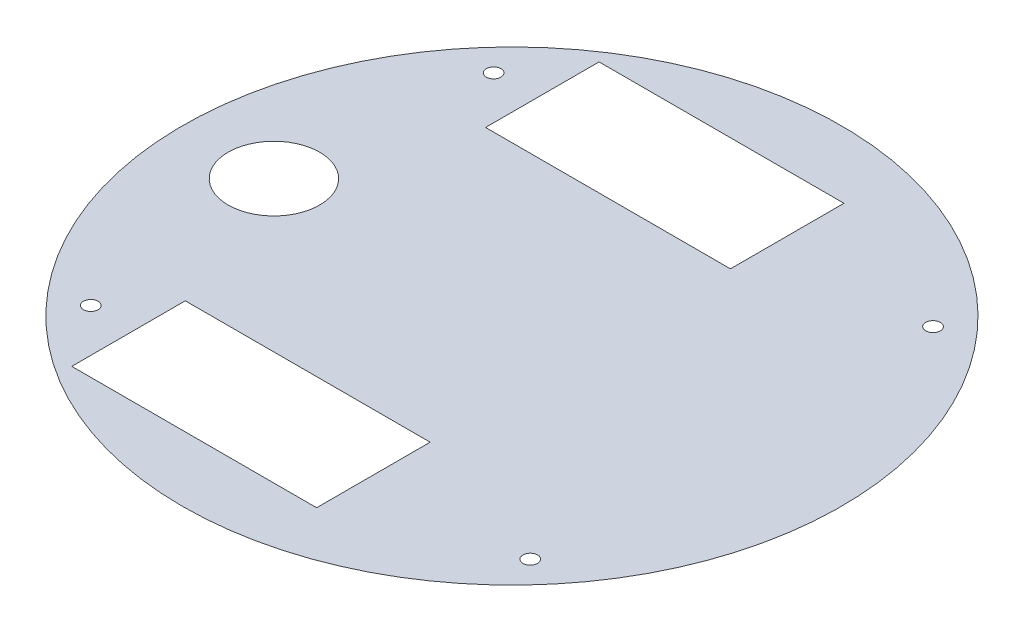
ISO-10303-21;
HEADER;
FILE_DESCRIPTION(('STEP AP214'),'2;1');
FILE_NAME('part.step','',(''),(''),'','','');
FILE_SCHEMA(('AUTOMOTIVE_DESIGN { 1 0 10303 214 1 1 1 1 }'));
ENDSEC;
DATA;
#1=APPLICATION_CONTEXT('core data for automotive mechanical design processes');
#2=APPLICATION_PROTOCOL_DEFINITION('international standard','automotive_design',2000,#1);
#3=PRODUCT_CONTEXT('',#1,'mechanical');
#4=PRODUCT('Part','Part','',(#3));
#5=PRODUCT_RELATED_PRODUCT_CATEGORY('part','',(#4));
#6=PRODUCT_DEFINITION_FORMATION('','',#4);
#7=PRODUCT_DEFINITION_CONTEXT('part definition',#1,'design');
#8=PRODUCT_DEFINITION('design','',#6,#7);
#9=PRODUCT_DEFINITION_SHAPE('','',#8);
#10=(LENGTH_UNIT() NAMED_UNIT(*) SI_UNIT(.MILLI.,.METRE.));
#11=(NAMED_UNIT(*) PLANE_ANGLE_UNIT() SI_UNIT($,.RADIAN.));
#12=(NAMED_UNIT(*) SI_UNIT($,.STERADIAN.) SOLID_ANGLE_UNIT());
#13=UNCERTAINTY_MEASURE_WITH_UNIT(LENGTH_MEASURE(1.E-05),#10,'distance_accuracy_value','');
#14=(GEOMETRIC_REPRESENTATION_CONTEXT(3) GLOBAL_UNCERTAINTY_ASSIGNED_CONTEXT((#13)) GLOBAL_UNIT_ASSIGNED_CONTEXT((#10,
#11,#12)) REPRESENTATION_CONTEXT('',''));
#15=CARTESIAN_POINT('',(0.,0.,0.));
#16=DIRECTION('',(0.,0.,1.));
#17=DIRECTION('',(1.,0.,0.));
#18=AXIS2_PLACEMENT_3D('',#15,#16,#17);
#19=CARTESIAN_POINT('',(6.0478827098623,-22.8430459681049,179.9999999651));
#20=DIRECTION('',(1.,0.,0.));
#21=DIRECTION('',(0.,1.,0.));
#22=AXIS2_PLACEMENT_3D('',#19,#20,#21);
#23=CYLINDRICAL_SURFACE('',#22,10.5);
#24=CARTESIAN_POINT('',(6.0478827098623,-22.8430459681049,179.9999999651));
#25=DIRECTION('',(1.,0.,0.));
#26=DIRECTION('',(0.,0.,-1.));
#27=AXIS2_PLACEMENT_3D('',#24,#25,#26);
#28=CIRCLE('',#27,10.5);
#29=CARTESIAN_POINT('',(6.0478827098623,-22.8430459681049,169.4999999651));
#30=VERTEX_POINT('',#29);
#31=EDGE_CURVE('E177',#30,#30,#28,.T.);
#32=ORIENTED_EDGE('',*,*,#31,.F.);
#33=EDGE_LOOP('',(#32));
#34=FACE_BOUND('',#33,.T.);
#35=CARTESIAN_POINT('',(26.0478827098623,-22.8430459681049,179.9999999651));
#36=DIRECTION('',(1.,0.,0.));
#37=DIRECTION('',(0.,0.,-1.));
#38=AXIS2_PLACEMENT_3D('',#35,#36,#37);
#39=CIRCLE('',#38,10.5);
#40=CARTESIAN_POINT('',(26.0478827098623,-22.8430459681049,169.4999999651));
#41=VERTEX_POINT('',#40);
#42=EDGE_CURVE('E180',#41,#41,#39,.T.);
#43=ORIENTED_EDGE('',*,*,#42,.T.);
#44=EDGE_LOOP('',(#43));
#45=FACE_BOUND('',#44,.T.);
#46=ADVANCED_FACE('F76',(#34,#45),#23,.F.);
#47=CARTESIAN_POINT('',(6.0478827098623,0.,192.9999999651));
#48=DIRECTION('',(0.,0.,1.));
#49=DIRECTION('',(1.,0.,0.));
#50=AXIS2_PLACEMENT_3D('',#47,#48,#49);
#51=PLANE('',#50);
#52=DIRECTION('',(1.,0.,0.));
#53=VECTOR('',#52,1.);
#54=CARTESIAN_POINT('',(6.0478827098623,-2.84304596810474,192.9999999651));
#55=LINE('',#54,#53);
#56=CARTESIAN_POINT('',(6.0478827098623,-2.84304596810474,192.9999999651));
#57=VERTEX_POINT('',#56);
#58=CARTESIAN_POINT('',(26.0478827098623,-2.84304596810474,192.9999999651));
#59=VERTEX_POINT('',#58);
#60=EDGE_CURVE('E13',#57,#59,#55,.T.);
#61=ORIENTED_EDGE('',*,*,#60,.F.);
#62=DIRECTION('',(0.,-1.,0.));
#63=VECTOR('',#62,1.);
#64=CARTESIAN_POINT('',(6.0478827098623,0.,192.9999999651));
#65=LINE('',#64,#63);
#66=CARTESIAN_POINT('',(6.0478827098623,-22.843045968105,192.9999999651));
#67=VERTEX_POINT('',#66);
#68=EDGE_CURVE('E192',#57,#67,#65,.T.);
#69=ORIENTED_EDGE('',*,*,#68,.T.);
#70=DIRECTION('',(1.,0.,0.));
#71=VECTOR('',#70,1.);
#72=CARTESIAN_POINT('',(6.0478827098623,-22.843045968105,192.9999999651));
#73=LINE('',#72,#71);
#74=CARTESIAN_POINT('',(26.0478827098623,-22.843045968105,192.9999999651));
#75=VERTEX_POINT('',#74);
#76=EDGE_CURVE('E167',#67,#75,#73,.T.);
#77=ORIENTED_EDGE('',*,*,#76,.T.);
#78=DIRECTION('',(0.,-1.,0.));
#79=VECTOR('',#78,1.);
#80=CARTESIAN_POINT('',(26.0478827098623,0.,192.9999999651));
#81=LINE('',#80,#79);
#82=EDGE_CURVE('E143',#59,#75,#81,.T.);
#83=ORIENTED_EDGE('',*,*,#82,.F.);
#84=EDGE_LOOP('',(#61,#69,#77,#83));
#85=FACE_BOUND('',#84,.T.);
#86=ADVANCED_FACE('F217',(#85),#51,.T.);
#87=CARTESIAN_POINT('',(6.0478827098623,2.15695403189528,0.));
#88=DIRECTION('',(0.,1.,0.));
#89=DIRECTION('',(0.,0.,1.));
#90=AXIS2_PLACEMENT_3D('',#87,#88,#89);
#91=PLANE('',#90);
#92=DIRECTION('',(0.,0.,1.));
#93=VECTOR('',#92,1.);
#94=CARTESIAN_POINT('',(26.0478827098623,2.15695403189528,0.));
#95=LINE('',#94,#93);
#96=CARTESIAN_POINT('',(26.0478827098623,2.15695403189526,157.9999999651));
#97=VERTEX_POINT('',#96);
#98=CARTESIAN_POINT('',(26.0478827098623,2.15695403189526,201.9999999651));
#99=VERTEX_POINT('',#98);
#100=EDGE_CURVE('E130',#97,#99,#95,.T.);
#101=ORIENTED_EDGE('',*,*,#100,.F.);
#102=DIRECTION('',(1.,0.,0.));
#103=VECTOR('',#102,1.);
#104=CARTESIAN_POINT('',(6.0478827098623,2.15695403189526,157.9999999651));
#105=LINE('',#104,#103);
#106=CARTESIAN_POINT('',(6.0478827098623,2.15695403189526,157.9999999651));
#107=VERTEX_POINT('',#106);
#108=EDGE_CURVE('E162',#107,#97,#105,.T.);
#109=ORIENTED_EDGE('',*,*,#108,.F.);
#110=DIRECTION('',(0.,0.,1.));
#111=VECTOR('',#110,1.);
#112=CARTESIAN_POINT('',(6.0478827098623,2.15695403189528,0.));
#113=LINE('',#112,#111);
#114=CARTESIAN_POINT('',(6.0478827098623,2.15695403189526,201.9999999651));
#115=VERTEX_POINT('',#114);
#116=EDGE_CURVE('E149',#107,#115,#113,.T.);
#117=ORIENTED_EDGE('',*,*,#116,.T.);
#118=DIRECTION('',(1.,0.,0.));
#119=VECTOR('',#118,1.);
#120=CARTESIAN_POINT('',(6.0478827098623,2.15695403189526,201.9999999651));
#121=LINE('',#120,#119);
#122=EDGE_CURVE('E147',#115,#99,#121,.T.);
#123=ORIENTED_EDGE('',*,*,#122,.T.);
#124=EDGE_LOOP('',(#101,#109,#117,#123));
#125=FACE_BOUND('',#124,.T.);
#126=ADVANCED_FACE('F148',(#125),#91,.T.);
#127=CARTESIAN_POINT('',(6.0478827098623,0.,166.9999999651));
#128=DIRECTION('',(0.,0.,1.));
#129=DIRECTION('',(1.,0.,0.));
#130=AXIS2_PLACEMENT_3D('',#127,#128,#129);
#131=PLANE('',#130);
#132=DIRECTION('',(0.,-1.,0.));
#133=VECTOR('',#132,1.);
#134=CARTESIAN_POINT('',(6.0478827098623,0.,166.9999999651));
#135=LINE('',#134,#133);
#136=CARTESIAN_POINT('',(6.0478827098623,-2.84304596810474,166.9999999651));
#137=VERTEX_POINT('',#136);
#138=CARTESIAN_POINT('',(6.0478827098623,-22.843045968105,166.9999999651));
#139=VERTEX_POINT('',#138);
#140=EDGE_CURVE('E196',#137,#139,#135,.T.);
#141=ORIENTED_EDGE('',*,*,#140,.F.);
#142=DIRECTION('',(1.,0.,0.));
#143=VECTOR('',#142,1.);
#144=CARTESIAN_POINT('',(6.0478827098623,-2.84304596810474,166.9999999651));
#145=LINE('',#144,#143);
#146=CARTESIAN_POINT('',(26.0478827098623,-2.84304596810474,166.9999999651));
#147=VERTEX_POINT('',#146);
#148=EDGE_CURVE('E86',#137,#147,#145,.T.);
#149=ORIENTED_EDGE('',*,*,#148,.T.);
#150=DIRECTION('',(0.,-1.,0.));
#151=VECTOR('',#150,1.);
#152=CARTESIAN_POINT('',(26.0478827098623,0.,166.9999999651));
#153=LINE('',#152,#151);
#154=CARTESIAN_POINT('',(26.0478827098623,-22.843045968105,166.9999999651));
#155=VERTEX_POINT('',#154);
#156=EDGE_CURVE('E144',#147,#155,#153,.T.);
#157=ORIENTED_EDGE('',*,*,#156,.T.);
#158=DIRECTION('',(1.,0.,0.));
#159=VECTOR('',#158,1.);
#160=CARTESIAN_POINT('',(6.0478827098623,-22.843045968105,166.9999999651));
#161=LINE('',#160,#159);
#162=EDGE_CURVE('E174',#139,#155,#161,.T.);
#163=ORIENTED_EDGE('',*,*,#162,.F.);
#164=EDGE_LOOP('',(#141,#149,#157,#163));
#165=FACE_BOUND('',#164,.T.);
#166=ADVANCED_FACE('F230',(#165),#131,.F.);
#167=CARTESIAN_POINT('',(6.0478827098623,-22.8430459681049,179.9999999651));
#168=DIRECTION('',(1.,0.,0.));
#169=DIRECTION('',(0.,1.,0.));
#170=AXIS2_PLACEMENT_3D('',#167,#168,#169);
#171=CYLINDRICAL_SURFACE('',#170,13.);
#172=CARTESIAN_POINT('',(26.0478827098623,-22.8430459681049,179.9999999651));
#173=DIRECTION('',(1.,0.,0.));
#174=DIRECTION('',(0.,0.,-1.));
#175=AXIS2_PLACEMENT_3D('',#172,#173,#174);
#176=CIRCLE('',#175,13.);
#177=EDGE_CURVE('E165',#155,#75,#176,.F.);
#178=ORIENTED_EDGE('',*,*,#177,.T.);
#179=ORIENTED_EDGE('',*,*,#76,.F.);
#180=CARTESIAN_POINT('',(6.0478827098623,-22.8430459681049,179.9999999651));
#181=DIRECTION('',(1.,0.,0.));
#182=DIRECTION('',(0.,0.,-1.));
#183=AXIS2_PLACEMENT_3D('',#180,#181,#182);
#184=CIRCLE('',#183,13.);
#185=EDGE_CURVE('E183',#139,#67,#184,.F.);
#186=ORIENTED_EDGE('',*,*,#185,.F.);
#187=ORIENTED_EDGE('',*,*,#162,.T.);
#188=EDGE_LOOP('',(#178,#179,#186,#187));
#189=FACE_BOUND('',#188,.T.);
#190=ADVANCED_FACE('F213',(#189),#171,.T.);
#191=CARTESIAN_POINT('',(26.0478827098623,0.,0.));
#192=DIRECTION('',(1.,0.,0.));
#193=DIRECTION('',(0.,0.,-1.));
#194=AXIS2_PLACEMENT_3D('',#191,#192,#193);
#195=PLANE('',#194);
#196=ORIENTED_EDGE('',*,*,#177,.F.);
#197=ORIENTED_EDGE('',*,*,#156,.F.);
#198=DIRECTION('',(0.,0.,-1.));
#199=VECTOR('',#198,1.);
#200=CARTESIAN_POINT('',(26.0478827098623,-2.84304596810474,166.9999999651));
#201=LINE('',#200,#199);
#202=CARTESIAN_POINT('',(26.0478827098623,-2.84304596810474,157.9999999651));
#203=VERTEX_POINT('',#202);
#204=EDGE_CURVE('E170',#147,#203,#201,.T.);
#205=ORIENTED_EDGE('',*,*,#204,.T.);
#206=DIRECTION('',(0.,-1.,0.));
#207=VECTOR('',#206,1.);
#208=CARTESIAN_POINT('',(26.0478827098623,2.15695403189526,157.9999999651));
#209=LINE('',#208,#207);
#210=EDGE_CURVE('E139',#97,#203,#209,.T.);
#211=ORIENTED_EDGE('',*,*,#210,.F.);
#212=ORIENTED_EDGE('',*,*,#100,.T.);
#213=DIRECTION('',(0.,-1.,0.));
#214=VECTOR('',#213,1.);
#215=CARTESIAN_POINT('',(26.0478827098623,2.15695403189526,201.9999999651));
#216=LINE('',#215,#214);
#217=CARTESIAN_POINT('',(26.0478827098623,-2.84304596810474,201.9999999651));
#218=VERTEX_POINT('',#217);
#219=EDGE_CURVE('E136',#99,#218,#216,.T.);
#220=ORIENTED_EDGE('',*,*,#219,.T.);
#221=DIRECTION('',(0.,0.,1.));
#222=VECTOR('',#221,1.);
#223=CARTESIAN_POINT('',(26.0478827098623,-2.84304596810474,192.9999999651));
#224=LINE('',#223,#222);
#225=EDGE_CURVE('E154',#59,#218,#224,.T.);
#226=ORIENTED_EDGE('',*,*,#225,.F.);
#227=ORIENTED_EDGE('',*,*,#82,.T.);
#228=EDGE_LOOP('',(#196,#197,#205,#211,#212,#220,#226,#227));
#229=FACE_BOUND('',#228,.T.);
#230=ORIENTED_EDGE('',*,*,#42,.F.);
#231=EDGE_LOOP('',(#230));
#232=FACE_BOUND('',#231,.T.);
#233=ADVANCED_FACE('F133',(#229,#232),#195,.T.);
#234=CARTESIAN_POINT('',(6.0478827098623,0.,0.));
#235=DIRECTION('',(1.,0.,0.));
#236=DIRECTION('',(0.,0.,-1.));
#237=AXIS2_PLACEMENT_3D('',#234,#235,#236);
#238=PLANE('',#237);
#239=ORIENTED_EDGE('',*,*,#185,.T.);
#240=ORIENTED_EDGE('',*,*,#68,.F.);
#241=DIRECTION('',(0.,0.,1.));
#242=VECTOR('',#241,1.);
#243=CARTESIAN_POINT('',(6.0478827098623,-2.84304596810474,192.9999999651));
#244=LINE('',#243,#242);
#245=CARTESIAN_POINT('',(6.0478827098623,-2.84304596810474,201.9999999651));
#246=VERTEX_POINT('',#245);
#247=EDGE_CURVE('E153',#57,#246,#244,.T.);
#248=ORIENTED_EDGE('',*,*,#247,.T.);
#249=DIRECTION('',(0.,-1.,0.));
#250=VECTOR('',#249,1.);
#251=CARTESIAN_POINT('',(6.0478827098623,2.15695403189526,201.9999999651));
#252=LINE('',#251,#250);
#253=EDGE_CURVE('E151',#115,#246,#252,.T.);
#254=ORIENTED_EDGE('',*,*,#253,.F.);
#255=ORIENTED_EDGE('',*,*,#116,.F.);
#256=DIRECTION('',(0.,-1.,0.));
#257=VECTOR('',#256,1.);
#258=CARTESIAN_POINT('',(6.0478827098623,2.15695403189526,157.9999999651));
#259=LINE('',#258,#257);
#260=CARTESIAN_POINT('',(6.0478827098623,-2.84304596810474,157.9999999651));
#261=VERTEX_POINT('',#260);
#262=EDGE_CURVE('E163',#107,#261,#259,.T.);
#263=ORIENTED_EDGE('',*,*,#262,.T.);
#264=DIRECTION('',(0.,0.,-1.));
#265=VECTOR('',#264,1.);
#266=CARTESIAN_POINT('',(6.0478827098623,-2.84304596810474,166.9999999651));
#267=LINE('',#266,#265);
#268=EDGE_CURVE('E169',#137,#261,#267,.T.);
#269=ORIENTED_EDGE('',*,*,#268,.F.);
#270=ORIENTED_EDGE('',*,*,#140,.T.);
#271=EDGE_LOOP('',(#239,#240,#248,#254,#255,#263,#269,#270));
#272=FACE_BOUND('',#271,.T.);
#273=ORIENTED_EDGE('',*,*,#31,.T.);
#274=EDGE_LOOP('',(#273));
#275=FACE_BOUND('',#274,.T.);
#276=ADVANCED_FACE('F205',(#272,#275),#238,.F.);
#277=CARTESIAN_POINT('',(6.0478827098623,2.15695403189526,201.9999999651));
#278=DIRECTION('',(0.,0.,1.));
#279=DIRECTION('',(1.,0.,0.));
#280=AXIS2_PLACEMENT_3D('',#277,#278,#279);
#281=PLANE('',#280);
#282=ORIENTED_EDGE('',*,*,#219,.F.);
#283=ORIENTED_EDGE('',*,*,#122,.F.);
#284=ORIENTED_EDGE('',*,*,#253,.T.);
#285=DIRECTION('',(1.,0.,0.));
#286=VECTOR('',#285,1.);
#287=CARTESIAN_POINT('',(6.0478827098623,-2.84304596810474,201.9999999651));
#288=LINE('',#287,#286);
#289=EDGE_CURVE('E80',#246,#218,#288,.T.);
#290=ORIENTED_EDGE('',*,*,#289,.T.);
#291=EDGE_LOOP('',(#282,#283,#284,#290));
#292=FACE_BOUND('',#291,.T.);
#293=ADVANCED_FACE('F152',(#292),#281,.T.);
#294=CARTESIAN_POINT('',(6.0478827098623,-2.84304596810474,192.9999999651));
#295=DIRECTION('',(0.,1.,0.));
#296=DIRECTION('',(0.,0.,1.));
#297=AXIS2_PLACEMENT_3D('',#294,#295,#296);
#298=PLANE('',#297);
#299=ORIENTED_EDGE('',*,*,#225,.T.);
#300=ORIENTED_EDGE('',*,*,#289,.F.);
#301=ORIENTED_EDGE('',*,*,#247,.F.);
#302=ORIENTED_EDGE('',*,*,#60,.T.);
#303=EDGE_LOOP('',(#299,#300,#301,#302));
#304=FACE_BOUND('',#303,.T.);
#305=ADVANCED_FACE('F78',(#304),#298,.F.);
#306=CARTESIAN_POINT('',(6.0478827098623,2.15695403189526,157.9999999651));
#307=DIRECTION('',(0.,0.,1.));
#308=DIRECTION('',(1.,0.,0.));
#309=AXIS2_PLACEMENT_3D('',#306,#307,#308);
#310=PLANE('',#309);
#311=ORIENTED_EDGE('',*,*,#210,.T.);
#312=DIRECTION('',(1.,0.,0.));
#313=VECTOR('',#312,1.);
#314=CARTESIAN_POINT('',(6.0478827098623,-2.84304596810474,157.9999999651));
#315=LINE('',#314,#313);
#316=EDGE_CURVE('E160',#261,#203,#315,.T.);
#317=ORIENTED_EDGE('',*,*,#316,.F.);
#318=ORIENTED_EDGE('',*,*,#262,.F.);
#319=ORIENTED_EDGE('',*,*,#108,.T.);
#320=EDGE_LOOP('',(#311,#317,#318,#319));
#321=FACE_BOUND('',#320,.T.);
#322=ADVANCED_FACE('F227',(#321),#310,.F.);
#323=CARTESIAN_POINT('',(6.0478827098623,-2.84304596810474,166.9999999651));
#324=DIRECTION('',(0.,-1.,0.));
#325=DIRECTION('',(1.,0.,0.));
#326=AXIS2_PLACEMENT_3D('',#323,#324,#325);
#327=PLANE('',#326);
#328=ORIENTED_EDGE('',*,*,#204,.F.);
#329=ORIENTED_EDGE('',*,*,#148,.F.);
#330=ORIENTED_EDGE('',*,*,#268,.T.);
#331=ORIENTED_EDGE('',*,*,#316,.T.);
#332=EDGE_LOOP('',(#328,#329,#330,#331));
#333=FACE_BOUND('',#332,.T.);
#334=ADVANCED_FACE('F228',(#333),#327,.T.);
#335=CLOSED_SHELL('',(#46,#86,#126,#166,#190,#233,#276,#293,#305,#322,#334));
#336=MANIFOLD_SOLID_BREP('B2',#335);
#337=CARTESIAN_POINT('',(-4.2343678264036,2.15695403189526,180.));
#338=DIRECTION('',(0.,1.,0.));
#339=DIRECTION('',(0.,0.,1.));
#340=AXIS2_PLACEMENT_3D('',#337,#338,#339);
#341=PLANE('',#340);
#342=CARTESIAN_POINT('',(55.7656321735964,2.15695403189526,125.));
#343=DIRECTION('',(0.,1.,0.));
#344=DIRECTION('',(0.,0.,1.));
#345=AXIS2_PLACEMENT_3D('',#342,#343,#344);
#346=CIRCLE('',#345,2.);
#347=CARTESIAN_POINT('',(55.7656321735964,2.15695403189526,127.));
#348=VERTEX_POINT('',#347);
#349=EDGE_CURVE('E358',#348,#348,#346,.T.);
#350=ORIENTED_EDGE('',*,*,#349,.T.);
#351=EDGE_LOOP('',(#350));
#352=FACE_BOUND('',#351,.T.);
#353=CARTESIAN_POINT('',(55.7656321735964,2.15695403189526,235.));
#354=DIRECTION('',(0.,1.,0.));
#355=DIRECTION('',(0.,0.,1.));
#356=AXIS2_PLACEMENT_3D('',#353,#354,#355);
#357=CIRCLE('',#356,2.);
#358=CARTESIAN_POINT('',(55.7656321735964,2.15695403189526,237.));
#359=VERTEX_POINT('',#358);
#360=EDGE_CURVE('E363',#359,#359,#357,.T.);
#361=ORIENTED_EDGE('',*,*,#360,.T.);
#362=EDGE_LOOP('',(#361));
#363=FACE_BOUND('',#362,.T.);
#364=CARTESIAN_POINT('',(-64.2343678264036,2.15695403189526,235.));
#365=DIRECTION('',(0.,1.,0.));
#366=DIRECTION('',(0.,0.,1.));
#367=AXIS2_PLACEMENT_3D('',#364,#365,#366);
#368=CIRCLE('',#367,2.);
#369=CARTESIAN_POINT('',(-64.2343678264036,2.15695403189526,237.));
#370=VERTEX_POINT('',#369);
#371=EDGE_CURVE('E444',#370,#370,#368,.T.);
#372=ORIENTED_EDGE('',*,*,#371,.T.);
#373=EDGE_LOOP('',(#372));
#374=FACE_BOUND('',#373,.T.);
#375=CARTESIAN_POINT('',(-64.2343678264036,2.15695403189526,125.));
#376=DIRECTION('',(0.,1.,0.));
#377=DIRECTION('',(0.,0.,1.));
#378=AXIS2_PLACEMENT_3D('',#375,#376,#377);
#379=CIRCLE('',#378,2.);
#380=CARTESIAN_POINT('',(-64.2343678264036,2.15695403189526,127.));
#381=VERTEX_POINT('',#380);
#382=EDGE_CURVE('E447',#381,#381,#379,.T.);
#383=ORIENTED_EDGE('',*,*,#382,.T.);
#384=EDGE_LOOP('',(#383));
#385=FACE_BOUND('',#384,.T.);
#386=CARTESIAN_POINT('',(-69.2343678264036,2.15695403189526,180.));
#387=DIRECTION('',(0.,1.,0.));
#388=DIRECTION('',(0.,0.,1.));
#389=AXIS2_PLACEMENT_3D('',#386,#387,#388);
#390=CIRCLE('',#389,12.5);
#391=CARTESIAN_POINT('',(-69.2343678264036,2.15695403189526,192.5));
#392=VERTEX_POINT('',#391);
#393=EDGE_CURVE('E408',#392,#392,#390,.T.);
#394=ORIENTED_EDGE('',*,*,#393,.T.);
#395=EDGE_LOOP('',(#394));
#396=FACE_BOUND('',#395,.T.);
#397=DIRECTION('',(1.,0.,0.));
#398=VECTOR('',#397,1.);
#399=CARTESIAN_POINT('',(-52.4343555870664,2.15695403189526,139.));
#400=LINE('',#399,#398);
#401=CARTESIAN_POINT('',(-52.4343555870664,2.15695403189526,139.));
#402=VERTEX_POINT('',#401);
#403=CARTESIAN_POINT('',(14.4343555870664,2.15695403189526,139.));
#404=VERTEX_POINT('',#403);
#405=EDGE_CURVE('E400',#402,#404,#400,.T.);
#406=ORIENTED_EDGE('',*,*,#405,.T.);
#407=DIRECTION('',(0.,0.,-1.));
#408=VECTOR('',#407,1.);
#409=CARTESIAN_POINT('',(14.4343555870664,2.15695403189526,108.));
#410=LINE('',#409,#408);
#411=CARTESIAN_POINT('',(14.4343555870664,2.15695403189526,108.));
#412=VERTEX_POINT('',#411);
#413=EDGE_CURVE('E403',#404,#412,#410,.T.);
#414=ORIENTED_EDGE('',*,*,#413,.T.);
#415=DIRECTION('',(-1.,0.,0.));
#416=VECTOR('',#415,1.);
#417=CARTESIAN_POINT('',(-52.4343555870664,2.15695403189526,108.));
#418=LINE('',#417,#416);
#419=CARTESIAN_POINT('',(-52.4343555870664,2.15695403189526,108.));
#420=VERTEX_POINT('',#419);
#421=EDGE_CURVE('E411',#412,#420,#418,.T.);
#422=ORIENTED_EDGE('',*,*,#421,.T.);
#423=DIRECTION('',(0.,0.,1.));
#424=VECTOR('',#423,1.);
#425=CARTESIAN_POINT('',(-52.4343555870664,2.15695403189526,108.));
#426=LINE('',#425,#424);
#427=EDGE_CURVE('E406',#420,#402,#426,.T.);
#428=ORIENTED_EDGE('',*,*,#427,.T.);
#429=EDGE_LOOP('',(#406,#414,#422,#428));
#430=FACE_BOUND('',#429,.T.);
#431=DIRECTION('',(1.,0.,0.));
#432=VECTOR('',#431,1.);
#433=CARTESIAN_POINT('',(-52.4343555870664,2.15695403189526,252.));
#434=LINE('',#433,#432);
#435=CARTESIAN_POINT('',(-52.4343555870664,2.15695403189526,252.));
#436=VERTEX_POINT('',#435);
#437=CARTESIAN_POINT('',(14.4343555870664,2.15695403189526,252.));
#438=VERTEX_POINT('',#437);
#439=EDGE_CURVE('E421',#436,#438,#434,.T.);
#440=ORIENTED_EDGE('',*,*,#439,.T.);
#441=DIRECTION('',(0.,0.,-1.));
#442=VECTOR('',#441,1.);
#443=CARTESIAN_POINT('',(14.4343555870664,2.15695403189526,221.));
#444=LINE('',#443,#442);
#445=CARTESIAN_POINT('',(14.4343555870664,2.15695403189526,221.));
#446=VERTEX_POINT('',#445);
#447=EDGE_CURVE('E424',#438,#446,#444,.T.);
#448=ORIENTED_EDGE('',*,*,#447,.T.);
#449=DIRECTION('',(-1.,0.,0.));
#450=VECTOR('',#449,1.);
#451=CARTESIAN_POINT('',(-52.4343555870664,2.15695403189526,221.));
#452=LINE('',#451,#450);
#453=CARTESIAN_POINT('',(-52.4343555870664,2.15695403189526,221.));
#454=VERTEX_POINT('',#453);
#455=EDGE_CURVE('E427',#446,#454,#452,.T.);
#456=ORIENTED_EDGE('',*,*,#455,.T.);
#457=DIRECTION('',(0.,0.,1.));
#458=VECTOR('',#457,1.);
#459=CARTESIAN_POINT('',(-52.4343555870664,2.15695403189526,221.));
#460=LINE('',#459,#458);
#461=EDGE_CURVE('E353',#454,#436,#460,.T.);
#462=ORIENTED_EDGE('',*,*,#461,.T.);
#463=EDGE_LOOP('',(#440,#448,#456,#462));
#464=FACE_BOUND('',#463,.T.);
#465=CARTESIAN_POINT('',(-4.2343678264036,2.15695403189526,180.));
#466=DIRECTION('',(0.,1.,0.));
#467=DIRECTION('',(0.,0.,1.));
#468=AXIS2_PLACEMENT_3D('',#465,#466,#467);
#469=CIRCLE('',#468,90.);
#470=CARTESIAN_POINT('',(-4.2343678264036,2.15695403189526,270.));
#471=VERTEX_POINT('',#470);
#472=EDGE_CURVE('E74',#471,#471,#469,.T.);
#473=ORIENTED_EDGE('',*,*,#472,.F.);
#474=EDGE_LOOP('',(#473));
#475=FACE_BOUND('',#474,.T.);
#476=ADVANCED_FACE('F348',(#352,#363,#374,#385,#396,#430,#464,#475),#341,.F.);
#477=OPEN_SHELL('',(#476));
#478=SHELL_BASED_SURFACE_MODEL('B7',(#477));
#479=CARTESIAN_POINT('',(5.0478827098623,-22.8430459681049,179.9999999651));
#480=DIRECTION('',(1.,0.,0.));
#481=DIRECTION('',(0.,-0.603154735637739,-0.797624200283423));
#482=AXIS2_PLACEMENT_3D('',#479,#480,#481);
#483=CYLINDRICAL_SURFACE('',#482,10.5);
#484=CARTESIAN_POINT('',(5.0478827098623,-22.8430459681049,179.9999999651));
#485=DIRECTION('',(-1.,0.,0.));
#486=DIRECTION('',(0.,0.603154735637739,0.797624200283423));
#487=AXIS2_PLACEMENT_3D('',#484,#485,#486);
#488=CIRCLE('',#487,10.5);
#489=CARTESIAN_POINT('',(5.0478827098623,-16.5099212439087,188.375054068076));
#490=VERTEX_POINT('',#489);
#491=EDGE_CURVE('E494',#490,#490,#488,.T.);
#492=ORIENTED_EDGE('',*,*,#491,.F.);
#493=EDGE_LOOP('',(#492));
#494=FACE_BOUND('',#493,.T.);
#495=CARTESIAN_POINT('',(26.0478827098623,-22.8430459681049,179.9999999651));
#496=DIRECTION('',(-1.,0.,0.));
#497=DIRECTION('',(0.,0.603154735637739,0.797624200283423));
#498=AXIS2_PLACEMENT_3D('',#495,#496,#497);
#499=CIRCLE('',#498,10.5);
#500=CARTESIAN_POINT('',(26.0478827098623,-16.5099212439087,188.375054068076));
#501=VERTEX_POINT('',#500);
#502=EDGE_CURVE('E346',#501,#501,#499,.T.);
#503=ORIENTED_EDGE('',*,*,#502,.T.);
#504=EDGE_LOOP('',(#503));
#505=FACE_BOUND('',#504,.T.);
#506=ADVANCED_FACE('F488',(#494,#505),#483,.T.);
#507=CARTESIAN_POINT('',(26.0478827098623,-22.8430459681049,179.9999999651));
#508=DIRECTION('',(-1.,0.,0.));
#509=DIRECTION('',(0.,0.603154735637739,0.797624200283423));
#510=AXIS2_PLACEMENT_3D('',#507,#508,#509);
#511=PLANE('',#510);
#512=ORIENTED_EDGE('',*,*,#502,.F.);
#513=EDGE_LOOP('',(#512));
#514=FACE_BOUND('',#513,.T.);
#515=ADVANCED_FACE('F489',(#514),#511,.F.);
#516=OPEN_SHELL('',(#506,#515));
#517=SHELL_BASED_SURFACE_MODEL('B68',(#516));
#518=ADVANCED_BREP_SHAPE_REPRESENTATION('',(#18,#336),#14);
#519=MANIFOLD_SURFACE_SHAPE_REPRESENTATION('',(#18,#478,#517),#14);
#520=SHAPE_REPRESENTATION('',(#18),#14);
#521=SHAPE_DEFINITION_REPRESENTATION(#9,#520);
#522=SHAPE_REPRESENTATION_RELATIONSHIP('','',#520,#518);
#523=SHAPE_REPRESENTATION_RELATIONSHIP('','',#520,#519);
ENDSEC;
END-ISO-10303-21;
